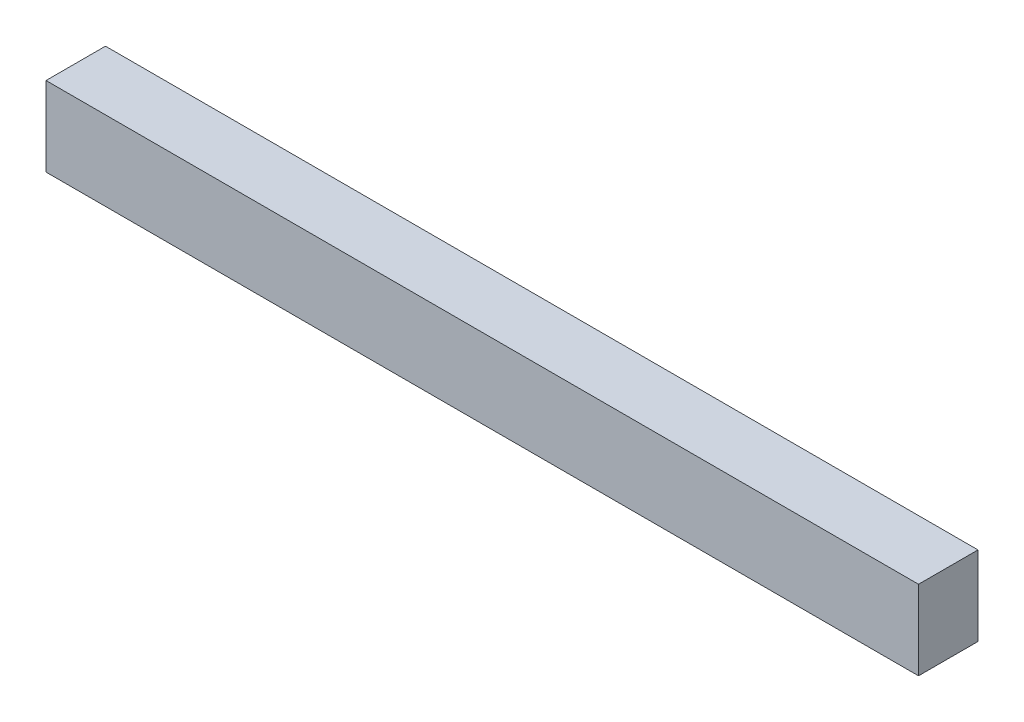
ISO-10303-21;
HEADER;
FILE_DESCRIPTION(('STEP AP214'),'2;1');
FILE_NAME('part.step','',(''),(''),'','','');
FILE_SCHEMA(('AUTOMOTIVE_DESIGN { 1 0 10303 214 1 1 1 1 }'));
ENDSEC;
DATA;
#1=APPLICATION_CONTEXT('core data for automotive mechanical design processes');
#2=APPLICATION_PROTOCOL_DEFINITION('international standard','automotive_design',2000,#1);
#3=PRODUCT_CONTEXT('',#1,'mechanical');
#4=PRODUCT('Part','Part','',(#3));
#5=PRODUCT_RELATED_PRODUCT_CATEGORY('part','',(#4));
#6=PRODUCT_DEFINITION_FORMATION('','',#4);
#7=PRODUCT_DEFINITION_CONTEXT('part definition',#1,'design');
#8=PRODUCT_DEFINITION('design','',#6,#7);
#9=PRODUCT_DEFINITION_SHAPE('','',#8);
#10=(LENGTH_UNIT() NAMED_UNIT(*) SI_UNIT(.MILLI.,.METRE.));
#11=(NAMED_UNIT(*) PLANE_ANGLE_UNIT() SI_UNIT($,.RADIAN.));
#12=(NAMED_UNIT(*) SI_UNIT($,.STERADIAN.) SOLID_ANGLE_UNIT());
#13=UNCERTAINTY_MEASURE_WITH_UNIT(LENGTH_MEASURE(1.E-05),#10,'distance_accuracy_value','');
#14=(GEOMETRIC_REPRESENTATION_CONTEXT(3) GLOBAL_UNCERTAINTY_ASSIGNED_CONTEXT((#13)) GLOBAL_UNIT_ASSIGNED_CONTEXT((#10,
#11,#12)) REPRESENTATION_CONTEXT('',''));
#15=CARTESIAN_POINT('',(0.,0.,0.));
#16=DIRECTION('',(0.,0.,1.));
#17=DIRECTION('',(1.,0.,0.));
#18=AXIS2_PLACEMENT_3D('',#15,#16,#17);
#19=CARTESIAN_POINT('',(0.,0.,30.));
#20=DIRECTION('',(1.,0.,0.));
#21=DIRECTION('',(0.,0.,-1.));
#22=AXIS2_PLACEMENT_3D('',#19,#20,#21);
#23=PLANE('',#22);
#24=DIRECTION('',(0.,-1.,0.));
#25=VECTOR('',#24,1.);
#26=CARTESIAN_POINT('',(0.,0.,0.));
#27=LINE('',#26,#25);
#28=CARTESIAN_POINT('',(0.,40.,0.));
#29=VERTEX_POINT('',#28);
#30=CARTESIAN_POINT('',(0.,0.,0.));
#31=VERTEX_POINT('',#30);
#32=EDGE_CURVE('E96',#29,#31,#27,.T.);
#33=ORIENTED_EDGE('',*,*,#32,.T.);
#34=DIRECTION('',(0.,0.,-1.));
#35=VECTOR('',#34,1.);
#36=CARTESIAN_POINT('',(0.,0.,30.));
#37=LINE('',#36,#35);
#38=CARTESIAN_POINT('',(0.,0.,30.));
#39=VERTEX_POINT('',#38);
#40=EDGE_CURVE('E11',#39,#31,#37,.T.);
#41=ORIENTED_EDGE('',*,*,#40,.F.);
#42=DIRECTION('',(0.,-1.,0.));
#43=VECTOR('',#42,1.);
#44=CARTESIAN_POINT('',(0.,0.,30.));
#45=LINE('',#44,#43);
#46=CARTESIAN_POINT('',(0.,40.,30.));
#47=VERTEX_POINT('',#46);
#48=EDGE_CURVE('E84',#47,#39,#45,.T.);
#49=ORIENTED_EDGE('',*,*,#48,.F.);
#50=DIRECTION('',(0.,0.,-1.));
#51=VECTOR('',#50,1.);
#52=CARTESIAN_POINT('',(0.,40.,30.));
#53=LINE('',#52,#51);
#54=EDGE_CURVE('E92',#47,#29,#53,.T.);
#55=ORIENTED_EDGE('',*,*,#54,.T.);
#56=EDGE_LOOP('',(#33,#41,#49,#55));
#57=FACE_BOUND('',#56,.T.);
#58=ADVANCED_FACE('F33',(#57),#23,.F.);
#59=CARTESIAN_POINT('',(0.,0.,30.));
#60=DIRECTION('',(0.,1.,0.));
#61=DIRECTION('',(0.,0.,1.));
#62=AXIS2_PLACEMENT_3D('',#59,#60,#61);
#63=PLANE('',#62);
#64=DIRECTION('',(1.,0.,0.));
#65=VECTOR('',#64,1.);
#66=CARTESIAN_POINT('',(0.,0.,0.));
#67=LINE('',#66,#65);
#68=CARTESIAN_POINT('',(440.,0.,0.));
#69=VERTEX_POINT('',#68);
#70=EDGE_CURVE('E88',#31,#69,#67,.T.);
#71=ORIENTED_EDGE('',*,*,#70,.T.);
#72=DIRECTION('',(0.,0.,-1.));
#73=VECTOR('',#72,1.);
#74=CARTESIAN_POINT('',(440.,0.,30.));
#75=LINE('',#74,#73);
#76=CARTESIAN_POINT('',(440.,0.,30.));
#77=VERTEX_POINT('',#76);
#78=EDGE_CURVE('E41',#77,#69,#75,.T.);
#79=ORIENTED_EDGE('',*,*,#78,.F.);
#80=DIRECTION('',(1.,0.,0.));
#81=VECTOR('',#80,1.);
#82=CARTESIAN_POINT('',(0.,0.,30.));
#83=LINE('',#82,#81);
#84=EDGE_CURVE('E79',#39,#77,#83,.T.);
#85=ORIENTED_EDGE('',*,*,#84,.F.);
#86=ORIENTED_EDGE('',*,*,#40,.T.);
#87=EDGE_LOOP('',(#71,#79,#85,#86));
#88=FACE_BOUND('',#87,.T.);
#89=ADVANCED_FACE('F87',(#88),#63,.F.);
#90=CARTESIAN_POINT('',(440.,0.,30.));
#91=DIRECTION('',(-1.,0.,0.));
#92=DIRECTION('',(0.,0.,1.));
#93=AXIS2_PLACEMENT_3D('',#90,#91,#92);
#94=PLANE('',#93);
#95=DIRECTION('',(0.,1.,0.));
#96=VECTOR('',#95,1.);
#97=CARTESIAN_POINT('',(440.,0.,0.));
#98=LINE('',#97,#96);
#99=CARTESIAN_POINT('',(440.,40.,0.));
#100=VERTEX_POINT('',#99);
#101=EDGE_CURVE('E66',#69,#100,#98,.T.);
#102=ORIENTED_EDGE('',*,*,#101,.T.);
#103=DIRECTION('',(0.,0.,-1.));
#104=VECTOR('',#103,1.);
#105=CARTESIAN_POINT('',(440.,40.,30.));
#106=LINE('',#105,#104);
#107=CARTESIAN_POINT('',(440.,40.,30.));
#108=VERTEX_POINT('',#107);
#109=EDGE_CURVE('E89',#108,#100,#106,.T.);
#110=ORIENTED_EDGE('',*,*,#109,.F.);
#111=DIRECTION('',(0.,1.,0.));
#112=VECTOR('',#111,1.);
#113=CARTESIAN_POINT('',(440.,0.,30.));
#114=LINE('',#113,#112);
#115=EDGE_CURVE('E82',#77,#108,#114,.T.);
#116=ORIENTED_EDGE('',*,*,#115,.F.);
#117=ORIENTED_EDGE('',*,*,#78,.T.);
#118=EDGE_LOOP('',(#102,#110,#116,#117));
#119=FACE_BOUND('',#118,.T.);
#120=ADVANCED_FACE('F90',(#119),#94,.F.);
#121=CARTESIAN_POINT('',(0.,40.,30.));
#122=DIRECTION('',(0.,-1.,0.));
#123=DIRECTION('',(0.,0.,-1.));
#124=AXIS2_PLACEMENT_3D('',#121,#122,#123);
#125=PLANE('',#124);
#126=DIRECTION('',(-1.,0.,0.));
#127=VECTOR('',#126,1.);
#128=CARTESIAN_POINT('',(0.,40.,0.));
#129=LINE('',#128,#127);
#130=EDGE_CURVE('E72',#100,#29,#129,.T.);
#131=ORIENTED_EDGE('',*,*,#130,.T.);
#132=ORIENTED_EDGE('',*,*,#54,.F.);
#133=DIRECTION('',(-1.,0.,0.));
#134=VECTOR('',#133,1.);
#135=CARTESIAN_POINT('',(0.,40.,30.));
#136=LINE('',#135,#134);
#137=EDGE_CURVE('E49',#108,#47,#136,.T.);
#138=ORIENTED_EDGE('',*,*,#137,.F.);
#139=ORIENTED_EDGE('',*,*,#109,.T.);
#140=EDGE_LOOP('',(#131,#132,#138,#139));
#141=FACE_BOUND('',#140,.T.);
#142=ADVANCED_FACE('F103',(#141),#125,.F.);
#143=CARTESIAN_POINT('',(0.,0.,30.));
#144=DIRECTION('',(0.,0.,-1.));
#145=DIRECTION('',(-1.,0.,0.));
#146=AXIS2_PLACEMENT_3D('',#143,#144,#145);
#147=PLANE('',#146);
#148=ORIENTED_EDGE('',*,*,#48,.T.);
#149=ORIENTED_EDGE('',*,*,#84,.T.);
#150=ORIENTED_EDGE('',*,*,#115,.T.);
#151=ORIENTED_EDGE('',*,*,#137,.T.);
#152=EDGE_LOOP('',(#148,#149,#150,#151));
#153=FACE_BOUND('',#152,.T.);
#154=ADVANCED_FACE('F80',(#153),#147,.F.);
#155=CARTESIAN_POINT('',(0.,0.,0.));
#156=DIRECTION('',(0.,0.,-1.));
#157=DIRECTION('',(-1.,0.,0.));
#158=AXIS2_PLACEMENT_3D('',#155,#156,#157);
#159=PLANE('',#158);
#160=ORIENTED_EDGE('',*,*,#32,.F.);
#161=ORIENTED_EDGE('',*,*,#130,.F.);
#162=ORIENTED_EDGE('',*,*,#101,.F.);
#163=ORIENTED_EDGE('',*,*,#70,.F.);
#164=EDGE_LOOP('',(#160,#161,#162,#163));
#165=FACE_BOUND('',#164,.T.);
#166=ADVANCED_FACE('F106',(#165),#159,.T.);
#167=CLOSED_SHELL('',(#58,#89,#120,#142,#154,#166));
#168=MANIFOLD_SOLID_BREP('B2',#167);
#169=ADVANCED_BREP_SHAPE_REPRESENTATION('',(#18,#168),#14);
#170=SHAPE_DEFINITION_REPRESENTATION(#9,#169);
ENDSEC;
END-ISO-10303-21;
